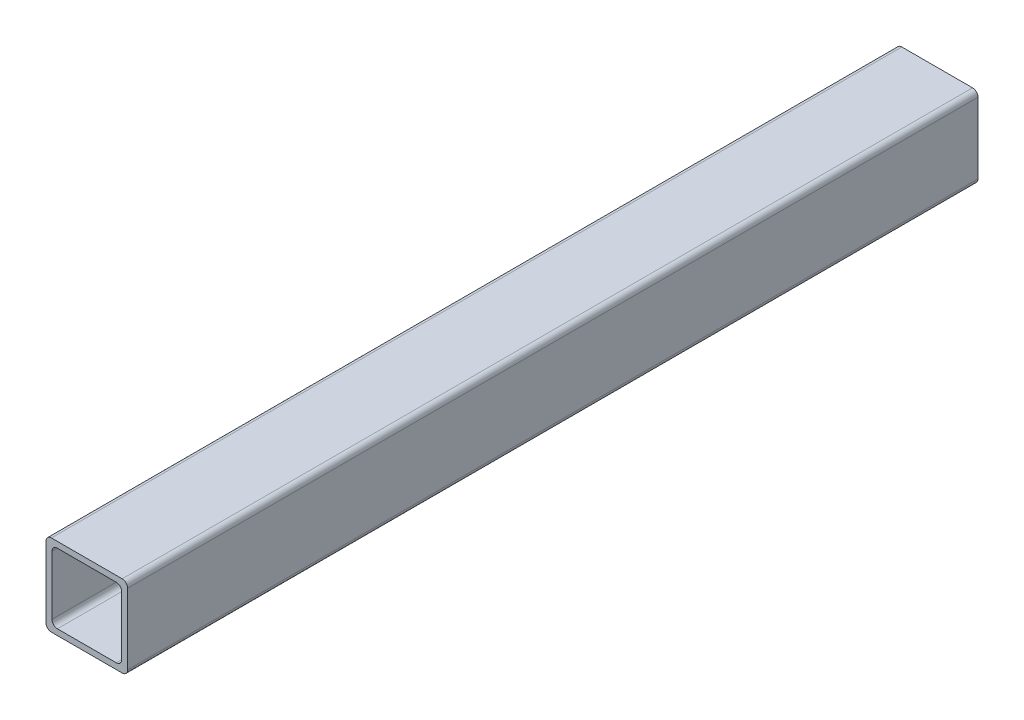
ISO-10303-21;
HEADER;
FILE_DESCRIPTION(('STEP AP214'),'2;1');
FILE_NAME('part.step','',(''),(''),'','','');
FILE_SCHEMA(('AUTOMOTIVE_DESIGN { 1 0 10303 214 1 1 1 1 }'));
ENDSEC;
DATA;
#1=APPLICATION_CONTEXT('core data for automotive mechanical design processes');
#2=APPLICATION_PROTOCOL_DEFINITION('international standard','automotive_design',2000,#1);
#3=PRODUCT_CONTEXT('',#1,'mechanical');
#4=PRODUCT('Part','Part','',(#3));
#5=PRODUCT_RELATED_PRODUCT_CATEGORY('part','',(#4));
#6=PRODUCT_DEFINITION_FORMATION('','',#4);
#7=PRODUCT_DEFINITION_CONTEXT('part definition',#1,'design');
#8=PRODUCT_DEFINITION('design','',#6,#7);
#9=PRODUCT_DEFINITION_SHAPE('','',#8);
#10=(LENGTH_UNIT() NAMED_UNIT(*) SI_UNIT(.MILLI.,.METRE.));
#11=(NAMED_UNIT(*) PLANE_ANGLE_UNIT() SI_UNIT($,.RADIAN.));
#12=(NAMED_UNIT(*) SI_UNIT($,.STERADIAN.) SOLID_ANGLE_UNIT());
#13=UNCERTAINTY_MEASURE_WITH_UNIT(LENGTH_MEASURE(1.E-05),#10,'distance_accuracy_value','');
#14=(GEOMETRIC_REPRESENTATION_CONTEXT(3) GLOBAL_UNCERTAINTY_ASSIGNED_CONTEXT((#13)) GLOBAL_UNIT_ASSIGNED_CONTEXT((#10,
#11,#12)) REPRESENTATION_CONTEXT('',''));
#15=CARTESIAN_POINT('',(0.,0.,0.));
#16=DIRECTION('',(0.,0.,1.));
#17=DIRECTION('',(1.,0.,0.));
#18=AXIS2_PLACEMENT_3D('',#15,#16,#17);
#19=CARTESIAN_POINT('',(2.54,-35.56,397.));
#20=DIRECTION('',(0.,0.,1.));
#21=DIRECTION('',(1.,0.,0.));
#22=AXIS2_PLACEMENT_3D('',#19,#20,#21);
#23=PLANE('',#22);
#24=CARTESIAN_POINT('',(2.54,-35.56,397.));
#25=DIRECTION('',(0.,0.,1.));
#26=DIRECTION('',(1.,0.,0.));
#27=AXIS2_PLACEMENT_3D('',#24,#25,#26);
#28=CIRCLE('',#27,2.54);
#29=CARTESIAN_POINT('',(0.,-35.56,397.));
#30=VERTEX_POINT('',#29);
#31=CARTESIAN_POINT('',(2.54000000000002,-38.1,397.));
#32=VERTEX_POINT('',#31);
#33=EDGE_CURVE('E211',#30,#32,#28,.T.);
#34=ORIENTED_EDGE('',*,*,#33,.T.);
#35=DIRECTION('',(1.,0.,0.));
#36=VECTOR('',#35,1.);
#37=CARTESIAN_POINT('',(2.54000000000002,-38.1,397.));
#38=LINE('',#37,#36);
#39=CARTESIAN_POINT('',(35.56,-38.1,397.));
#40=VERTEX_POINT('',#39);
#41=EDGE_CURVE('E214',#32,#40,#38,.T.);
#42=ORIENTED_EDGE('',*,*,#41,.T.);
#43=CARTESIAN_POINT('',(35.56,-35.56,397.));
#44=DIRECTION('',(0.,0.,1.));
#45=DIRECTION('',(-1.,0.,0.));
#46=AXIS2_PLACEMENT_3D('',#43,#44,#45);
#47=CIRCLE('',#46,2.54);
#48=CARTESIAN_POINT('',(38.1,-35.56,397.));
#49=VERTEX_POINT('',#48);
#50=EDGE_CURVE('E217',#40,#49,#47,.T.);
#51=ORIENTED_EDGE('',*,*,#50,.T.);
#52=DIRECTION('',(0.,1.,0.));
#53=VECTOR('',#52,1.);
#54=CARTESIAN_POINT('',(38.1,-2.54000000000002,397.));
#55=LINE('',#54,#53);
#56=CARTESIAN_POINT('',(38.1,-2.54000000000002,397.));
#57=VERTEX_POINT('',#56);
#58=EDGE_CURVE('E219',#49,#57,#55,.T.);
#59=ORIENTED_EDGE('',*,*,#58,.T.);
#60=CARTESIAN_POINT('',(35.56,-2.54,397.));
#61=DIRECTION('',(0.,0.,1.));
#62=DIRECTION('',(1.,0.,0.));
#63=AXIS2_PLACEMENT_3D('',#60,#61,#62);
#64=CIRCLE('',#63,2.54);
#65=CARTESIAN_POINT('',(35.56,0.,397.));
#66=VERTEX_POINT('',#65);
#67=EDGE_CURVE('E221',#57,#66,#64,.T.);
#68=ORIENTED_EDGE('',*,*,#67,.T.);
#69=DIRECTION('',(-1.,0.,0.));
#70=VECTOR('',#69,1.);
#71=CARTESIAN_POINT('',(2.54000000000002,0.,397.));
#72=LINE('',#71,#70);
#73=CARTESIAN_POINT('',(2.54000000000002,0.,397.));
#74=VERTEX_POINT('',#73);
#75=EDGE_CURVE('E223',#66,#74,#72,.T.);
#76=ORIENTED_EDGE('',*,*,#75,.T.);
#77=CARTESIAN_POINT('',(2.54,-2.54,397.));
#78=DIRECTION('',(0.,0.,1.));
#79=DIRECTION('',(-1.,0.,0.));
#80=AXIS2_PLACEMENT_3D('',#77,#78,#79);
#81=CIRCLE('',#80,2.54);
#82=CARTESIAN_POINT('',(0.,-2.54000000000002,397.));
#83=VERTEX_POINT('',#82);
#84=EDGE_CURVE('E225',#74,#83,#81,.T.);
#85=ORIENTED_EDGE('',*,*,#84,.T.);
#86=DIRECTION('',(0.,-1.,0.));
#87=VECTOR('',#86,1.);
#88=CARTESIAN_POINT('',(0.,-2.54000000000002,397.));
#89=LINE('',#88,#87);
#90=EDGE_CURVE('E227',#83,#30,#89,.T.);
#91=ORIENTED_EDGE('',*,*,#90,.T.);
#92=EDGE_LOOP('',(#34,#42,#51,#59,#68,#76,#85,#91));
#93=FACE_BOUND('',#92,.T.);
#94=DIRECTION('',(1.,0.,0.));
#95=VECTOR('',#94,1.);
#96=CARTESIAN_POINT('',(5.30860000000002,-35.3314,397.));
#97=LINE('',#96,#95);
#98=CARTESIAN_POINT('',(5.30860000000002,-35.3314,397.));
#99=VERTEX_POINT('',#98);
#100=CARTESIAN_POINT('',(32.7914,-35.3314,397.));
#101=VERTEX_POINT('',#100);
#102=EDGE_CURVE('E154',#99,#101,#97,.T.);
#103=ORIENTED_EDGE('',*,*,#102,.F.);
#104=CARTESIAN_POINT('',(5.3086,-32.7914,397.));
#105=DIRECTION('',(0.,0.,1.));
#106=DIRECTION('',(1.,0.,0.));
#107=AXIS2_PLACEMENT_3D('',#104,#105,#106);
#108=CIRCLE('',#107,2.54);
#109=CARTESIAN_POINT('',(2.7686,-32.7914,397.));
#110=VERTEX_POINT('',#109);
#111=EDGE_CURVE('E146',#110,#99,#108,.T.);
#112=ORIENTED_EDGE('',*,*,#111,.F.);
#113=DIRECTION('',(0.,-1.,0.));
#114=VECTOR('',#113,1.);
#115=CARTESIAN_POINT('',(2.7686,-5.30860000000002,397.));
#116=LINE('',#115,#114);
#117=CARTESIAN_POINT('',(2.7686,-5.30860000000002,397.));
#118=VERTEX_POINT('',#117);
#119=EDGE_CURVE('E179',#118,#110,#116,.T.);
#120=ORIENTED_EDGE('',*,*,#119,.F.);
#121=CARTESIAN_POINT('',(5.3086,-5.3086,397.));
#122=DIRECTION('',(0.,0.,1.));
#123=DIRECTION('',(1.,0.,0.));
#124=AXIS2_PLACEMENT_3D('',#121,#122,#123);
#125=CIRCLE('',#124,2.54);
#126=CARTESIAN_POINT('',(5.30860000000002,-2.7686,397.));
#127=VERTEX_POINT('',#126);
#128=EDGE_CURVE('E177',#127,#118,#125,.T.);
#129=ORIENTED_EDGE('',*,*,#128,.F.);
#130=DIRECTION('',(-1.,0.,0.));
#131=VECTOR('',#130,1.);
#132=CARTESIAN_POINT('',(5.30860000000002,-2.7686,397.));
#133=LINE('',#132,#131);
#134=CARTESIAN_POINT('',(32.7914,-2.7686,397.));
#135=VERTEX_POINT('',#134);
#136=EDGE_CURVE('E175',#135,#127,#133,.T.);
#137=ORIENTED_EDGE('',*,*,#136,.F.);
#138=CARTESIAN_POINT('',(32.7914,-5.3086,397.));
#139=DIRECTION('',(0.,0.,1.));
#140=DIRECTION('',(1.,0.,0.));
#141=AXIS2_PLACEMENT_3D('',#138,#139,#140);
#142=CIRCLE('',#141,2.54);
#143=CARTESIAN_POINT('',(35.3314,-5.30860000000002,397.));
#144=VERTEX_POINT('',#143);
#145=EDGE_CURVE('E173',#144,#135,#142,.T.);
#146=ORIENTED_EDGE('',*,*,#145,.F.);
#147=DIRECTION('',(0.,1.,0.));
#148=VECTOR('',#147,1.);
#149=CARTESIAN_POINT('',(35.3314,-5.30860000000002,397.));
#150=LINE('',#149,#148);
#151=CARTESIAN_POINT('',(35.3314,-32.7914,397.));
#152=VERTEX_POINT('',#151);
#153=EDGE_CURVE('E169',#152,#144,#150,.T.);
#154=ORIENTED_EDGE('',*,*,#153,.F.);
#155=CARTESIAN_POINT('',(32.7914,-32.7914,397.));
#156=DIRECTION('',(0.,0.,1.));
#157=DIRECTION('',(1.,0.,0.));
#158=AXIS2_PLACEMENT_3D('',#155,#156,#157);
#159=CIRCLE('',#158,2.54);
#160=EDGE_CURVE('E167',#101,#152,#159,.T.);
#161=ORIENTED_EDGE('',*,*,#160,.F.);
#162=EDGE_LOOP('',(#103,#112,#120,#129,#137,#146,#154,#161));
#163=FACE_BOUND('',#162,.T.);
#164=ADVANCED_FACE('F33',(#93,#163),#23,.T.);
#165=CARTESIAN_POINT('',(2.54,-35.56,0.));
#166=DIRECTION('',(0.,0.,1.));
#167=DIRECTION('',(1.,0.,0.));
#168=AXIS2_PLACEMENT_3D('',#165,#166,#167);
#169=PLANE('',#168);
#170=CARTESIAN_POINT('',(2.54,-35.56,0.));
#171=DIRECTION('',(0.,0.,1.));
#172=DIRECTION('',(1.,0.,0.));
#173=AXIS2_PLACEMENT_3D('',#170,#171,#172);
#174=CIRCLE('',#173,2.54);
#175=CARTESIAN_POINT('',(0.,-35.56,0.));
#176=VERTEX_POINT('',#175);
#177=CARTESIAN_POINT('',(2.54000000000002,-38.1,0.));
#178=VERTEX_POINT('',#177);
#179=EDGE_CURVE('E162',#176,#178,#174,.T.);
#180=ORIENTED_EDGE('',*,*,#179,.F.);
#181=DIRECTION('',(0.,-1.,0.));
#182=VECTOR('',#181,1.);
#183=CARTESIAN_POINT('',(0.,-2.54000000000002,0.));
#184=LINE('',#183,#182);
#185=CARTESIAN_POINT('',(0.,-2.54000000000002,0.));
#186=VERTEX_POINT('',#185);
#187=EDGE_CURVE('E215',#186,#176,#184,.T.);
#188=ORIENTED_EDGE('',*,*,#187,.F.);
#189=CARTESIAN_POINT('',(2.54,-2.54,0.));
#190=DIRECTION('',(0.,0.,1.));
#191=DIRECTION('',(-1.,0.,0.));
#192=AXIS2_PLACEMENT_3D('',#189,#190,#191);
#193=CIRCLE('',#192,2.54);
#194=CARTESIAN_POINT('',(2.54000000000002,0.,0.));
#195=VERTEX_POINT('',#194);
#196=EDGE_CURVE('E242',#195,#186,#193,.T.);
#197=ORIENTED_EDGE('',*,*,#196,.F.);
#198=DIRECTION('',(-1.,0.,0.));
#199=VECTOR('',#198,1.);
#200=CARTESIAN_POINT('',(2.54000000000002,0.,0.));
#201=LINE('',#200,#199);
#202=CARTESIAN_POINT('',(35.56,0.,0.));
#203=VERTEX_POINT('',#202);
#204=EDGE_CURVE('E240',#203,#195,#201,.T.);
#205=ORIENTED_EDGE('',*,*,#204,.F.);
#206=CARTESIAN_POINT('',(35.56,-2.54,0.));
#207=DIRECTION('',(0.,0.,1.));
#208=DIRECTION('',(1.,0.,0.));
#209=AXIS2_PLACEMENT_3D('',#206,#207,#208);
#210=CIRCLE('',#209,2.54);
#211=CARTESIAN_POINT('',(38.1,-2.54000000000002,0.));
#212=VERTEX_POINT('',#211);
#213=EDGE_CURVE('E238',#212,#203,#210,.T.);
#214=ORIENTED_EDGE('',*,*,#213,.F.);
#215=DIRECTION('',(0.,1.,0.));
#216=VECTOR('',#215,1.);
#217=CARTESIAN_POINT('',(38.1,-2.54000000000002,0.));
#218=LINE('',#217,#216);
#219=CARTESIAN_POINT('',(38.1,-35.56,0.));
#220=VERTEX_POINT('',#219);
#221=EDGE_CURVE('E236',#220,#212,#218,.T.);
#222=ORIENTED_EDGE('',*,*,#221,.F.);
#223=CARTESIAN_POINT('',(35.56,-35.56,0.));
#224=DIRECTION('',(0.,0.,1.));
#225=DIRECTION('',(-1.,0.,0.));
#226=AXIS2_PLACEMENT_3D('',#223,#224,#225);
#227=CIRCLE('',#226,2.54);
#228=CARTESIAN_POINT('',(35.56,-38.1,0.));
#229=VERTEX_POINT('',#228);
#230=EDGE_CURVE('E234',#229,#220,#227,.T.);
#231=ORIENTED_EDGE('',*,*,#230,.F.);
#232=DIRECTION('',(1.,0.,0.));
#233=VECTOR('',#232,1.);
#234=CARTESIAN_POINT('',(2.54000000000002,-38.1,0.));
#235=LINE('',#234,#233);
#236=EDGE_CURVE('E232',#178,#229,#235,.T.);
#237=ORIENTED_EDGE('',*,*,#236,.F.);
#238=EDGE_LOOP('',(#180,#188,#197,#205,#214,#222,#231,#237));
#239=FACE_BOUND('',#238,.T.);
#240=CARTESIAN_POINT('',(5.3086,-32.7914,0.));
#241=DIRECTION('',(0.,0.,1.));
#242=DIRECTION('',(1.,0.,0.));
#243=AXIS2_PLACEMENT_3D('',#240,#241,#242);
#244=CIRCLE('',#243,2.54);
#245=CARTESIAN_POINT('',(2.7686,-32.7914,0.));
#246=VERTEX_POINT('',#245);
#247=CARTESIAN_POINT('',(5.30860000000002,-35.3314,0.));
#248=VERTEX_POINT('',#247);
#249=EDGE_CURVE('E56',#246,#248,#244,.T.);
#250=ORIENTED_EDGE('',*,*,#249,.T.);
#251=DIRECTION('',(1.,0.,0.));
#252=VECTOR('',#251,1.);
#253=CARTESIAN_POINT('',(5.30860000000002,-35.3314,0.));
#254=LINE('',#253,#252);
#255=CARTESIAN_POINT('',(32.7914,-35.3314,0.));
#256=VERTEX_POINT('',#255);
#257=EDGE_CURVE('E161',#248,#256,#254,.T.);
#258=ORIENTED_EDGE('',*,*,#257,.T.);
#259=CARTESIAN_POINT('',(32.7914,-32.7914,0.));
#260=DIRECTION('',(0.,0.,1.));
#261=DIRECTION('',(1.,0.,0.));
#262=AXIS2_PLACEMENT_3D('',#259,#260,#261);
#263=CIRCLE('',#262,2.54);
#264=CARTESIAN_POINT('',(35.3314,-32.7914,0.));
#265=VERTEX_POINT('',#264);
#266=EDGE_CURVE('E183',#256,#265,#263,.T.);
#267=ORIENTED_EDGE('',*,*,#266,.T.);
#268=DIRECTION('',(0.,1.,0.));
#269=VECTOR('',#268,1.);
#270=CARTESIAN_POINT('',(35.3314,-5.30860000000002,0.));
#271=LINE('',#270,#269);
#272=CARTESIAN_POINT('',(35.3314,-5.30860000000002,0.));
#273=VERTEX_POINT('',#272);
#274=EDGE_CURVE('E186',#265,#273,#271,.T.);
#275=ORIENTED_EDGE('',*,*,#274,.T.);
#276=CARTESIAN_POINT('',(32.7914,-5.3086,0.));
#277=DIRECTION('',(0.,0.,1.));
#278=DIRECTION('',(1.,0.,0.));
#279=AXIS2_PLACEMENT_3D('',#276,#277,#278);
#280=CIRCLE('',#279,2.54);
#281=CARTESIAN_POINT('',(32.7914,-2.7686,0.));
#282=VERTEX_POINT('',#281);
#283=EDGE_CURVE('E189',#273,#282,#280,.T.);
#284=ORIENTED_EDGE('',*,*,#283,.T.);
#285=DIRECTION('',(-1.,0.,0.));
#286=VECTOR('',#285,1.);
#287=CARTESIAN_POINT('',(5.30860000000002,-2.7686,0.));
#288=LINE('',#287,#286);
#289=CARTESIAN_POINT('',(5.30860000000002,-2.7686,0.));
#290=VERTEX_POINT('',#289);
#291=EDGE_CURVE('E192',#282,#290,#288,.T.);
#292=ORIENTED_EDGE('',*,*,#291,.T.);
#293=CARTESIAN_POINT('',(5.3086,-5.3086,0.));
#294=DIRECTION('',(0.,0.,1.));
#295=DIRECTION('',(1.,0.,0.));
#296=AXIS2_PLACEMENT_3D('',#293,#294,#295);
#297=CIRCLE('',#296,2.54);
#298=CARTESIAN_POINT('',(2.7686,-5.30860000000002,0.));
#299=VERTEX_POINT('',#298);
#300=EDGE_CURVE('E195',#290,#299,#297,.T.);
#301=ORIENTED_EDGE('',*,*,#300,.T.);
#302=DIRECTION('',(0.,-1.,0.));
#303=VECTOR('',#302,1.);
#304=CARTESIAN_POINT('',(2.7686,-5.30860000000002,0.));
#305=LINE('',#304,#303);
#306=EDGE_CURVE('E155',#299,#246,#305,.T.);
#307=ORIENTED_EDGE('',*,*,#306,.T.);
#308=EDGE_LOOP('',(#250,#258,#267,#275,#284,#292,#301,#307));
#309=FACE_BOUND('',#308,.T.);
#310=ADVANCED_FACE('F272',(#239,#309),#169,.F.);
#311=CARTESIAN_POINT('',(2.54,-35.56,397.));
#312=DIRECTION('',(0.,0.,-1.));
#313=DIRECTION('',(-1.,0.,0.));
#314=AXIS2_PLACEMENT_3D('',#311,#312,#313);
#315=CYLINDRICAL_SURFACE('',#314,2.54);
#316=ORIENTED_EDGE('',*,*,#179,.T.);
#317=DIRECTION('',(0.,0.,-1.));
#318=VECTOR('',#317,1.);
#319=CARTESIAN_POINT('',(2.54000000000002,-38.1,397.));
#320=LINE('',#319,#318);
#321=EDGE_CURVE('E11',#32,#178,#320,.T.);
#322=ORIENTED_EDGE('',*,*,#321,.F.);
#323=ORIENTED_EDGE('',*,*,#33,.F.);
#324=DIRECTION('',(0.,0.,-1.));
#325=VECTOR('',#324,1.);
#326=CARTESIAN_POINT('',(0.,-35.56,397.));
#327=LINE('',#326,#325);
#328=EDGE_CURVE('E229',#30,#176,#327,.T.);
#329=ORIENTED_EDGE('',*,*,#328,.T.);
#330=EDGE_LOOP('',(#316,#322,#323,#329));
#331=FACE_BOUND('',#330,.T.);
#332=ADVANCED_FACE('F35',(#331),#315,.T.);
#333=CARTESIAN_POINT('',(2.54000000000002,-38.1,397.));
#334=DIRECTION('',(0.,1.,0.));
#335=DIRECTION('',(0.,0.,1.));
#336=AXIS2_PLACEMENT_3D('',#333,#334,#335);
#337=PLANE('',#336);
#338=ORIENTED_EDGE('',*,*,#236,.T.);
#339=DIRECTION('',(0.,0.,-1.));
#340=VECTOR('',#339,1.);
#341=CARTESIAN_POINT('',(35.56,-38.1,397.));
#342=LINE('',#341,#340);
#343=EDGE_CURVE('E41',#40,#229,#342,.T.);
#344=ORIENTED_EDGE('',*,*,#343,.F.);
#345=ORIENTED_EDGE('',*,*,#41,.F.);
#346=ORIENTED_EDGE('',*,*,#321,.T.);
#347=EDGE_LOOP('',(#338,#344,#345,#346));
#348=FACE_BOUND('',#347,.T.);
#349=ADVANCED_FACE('F289',(#348),#337,.F.);
#350=CARTESIAN_POINT('',(35.56,-35.56,397.));
#351=DIRECTION('',(0.,0.,-1.));
#352=DIRECTION('',(-1.,0.,0.));
#353=AXIS2_PLACEMENT_3D('',#350,#351,#352);
#354=CYLINDRICAL_SURFACE('',#353,2.54);
#355=ORIENTED_EDGE('',*,*,#230,.T.);
#356=DIRECTION('',(0.,0.,-1.));
#357=VECTOR('',#356,1.);
#358=CARTESIAN_POINT('',(38.1,-35.56,397.));
#359=LINE('',#358,#357);
#360=EDGE_CURVE('E259',#49,#220,#359,.T.);
#361=ORIENTED_EDGE('',*,*,#360,.F.);
#362=ORIENTED_EDGE('',*,*,#50,.F.);
#363=ORIENTED_EDGE('',*,*,#343,.T.);
#364=EDGE_LOOP('',(#355,#361,#362,#363));
#365=FACE_BOUND('',#364,.T.);
#366=ADVANCED_FACE('F266',(#365),#354,.T.);
#367=CARTESIAN_POINT('',(38.1,-2.54000000000002,397.));
#368=DIRECTION('',(-1.,0.,0.));
#369=DIRECTION('',(0.,-1.,0.));
#370=AXIS2_PLACEMENT_3D('',#367,#368,#369);
#371=PLANE('',#370);
#372=ORIENTED_EDGE('',*,*,#221,.T.);
#373=DIRECTION('',(0.,0.,-1.));
#374=VECTOR('',#373,1.);
#375=CARTESIAN_POINT('',(38.1,-2.54000000000002,397.));
#376=LINE('',#375,#374);
#377=EDGE_CURVE('E256',#57,#212,#376,.T.);
#378=ORIENTED_EDGE('',*,*,#377,.F.);
#379=ORIENTED_EDGE('',*,*,#58,.F.);
#380=ORIENTED_EDGE('',*,*,#360,.T.);
#381=EDGE_LOOP('',(#372,#378,#379,#380));
#382=FACE_BOUND('',#381,.T.);
#383=ADVANCED_FACE('F278',(#382),#371,.F.);
#384=CARTESIAN_POINT('',(35.56,-2.54,397.));
#385=DIRECTION('',(0.,0.,-1.));
#386=DIRECTION('',(-1.,0.,0.));
#387=AXIS2_PLACEMENT_3D('',#384,#385,#386);
#388=CYLINDRICAL_SURFACE('',#387,2.54);
#389=ORIENTED_EDGE('',*,*,#213,.T.);
#390=DIRECTION('',(0.,0.,-1.));
#391=VECTOR('',#390,1.);
#392=CARTESIAN_POINT('',(35.56,0.,397.));
#393=LINE('',#392,#391);
#394=EDGE_CURVE('E253',#66,#203,#393,.T.);
#395=ORIENTED_EDGE('',*,*,#394,.F.);
#396=ORIENTED_EDGE('',*,*,#67,.F.);
#397=ORIENTED_EDGE('',*,*,#377,.T.);
#398=EDGE_LOOP('',(#389,#395,#396,#397));
#399=FACE_BOUND('',#398,.T.);
#400=ADVANCED_FACE('F282',(#399),#388,.T.);
#401=CARTESIAN_POINT('',(2.54000000000002,0.,397.));
#402=DIRECTION('',(0.,-1.,0.));
#403=DIRECTION('',(0.,0.,-1.));
#404=AXIS2_PLACEMENT_3D('',#401,#402,#403);
#405=PLANE('',#404);
#406=ORIENTED_EDGE('',*,*,#204,.T.);
#407=DIRECTION('',(0.,0.,-1.));
#408=VECTOR('',#407,1.);
#409=CARTESIAN_POINT('',(2.54000000000002,0.,397.));
#410=LINE('',#409,#408);
#411=EDGE_CURVE('E250',#74,#195,#410,.T.);
#412=ORIENTED_EDGE('',*,*,#411,.F.);
#413=ORIENTED_EDGE('',*,*,#75,.F.);
#414=ORIENTED_EDGE('',*,*,#394,.T.);
#415=EDGE_LOOP('',(#406,#412,#413,#414));
#416=FACE_BOUND('',#415,.T.);
#417=ADVANCED_FACE('F302',(#416),#405,.F.);
#418=CARTESIAN_POINT('',(2.54,-2.54,397.));
#419=DIRECTION('',(0.,0.,-1.));
#420=DIRECTION('',(-1.,0.,0.));
#421=AXIS2_PLACEMENT_3D('',#418,#419,#420);
#422=CYLINDRICAL_SURFACE('',#421,2.54);
#423=ORIENTED_EDGE('',*,*,#196,.T.);
#424=DIRECTION('',(0.,0.,-1.));
#425=VECTOR('',#424,1.);
#426=CARTESIAN_POINT('',(0.,-2.54000000000002,397.));
#427=LINE('',#426,#425);
#428=EDGE_CURVE('E247',#83,#186,#427,.T.);
#429=ORIENTED_EDGE('',*,*,#428,.F.);
#430=ORIENTED_EDGE('',*,*,#84,.F.);
#431=ORIENTED_EDGE('',*,*,#411,.T.);
#432=EDGE_LOOP('',(#423,#429,#430,#431));
#433=FACE_BOUND('',#432,.T.);
#434=ADVANCED_FACE('F300',(#433),#422,.T.);
#435=CARTESIAN_POINT('',(0.,-2.54000000000002,397.));
#436=DIRECTION('',(1.,0.,0.));
#437=DIRECTION('',(0.,1.,0.));
#438=AXIS2_PLACEMENT_3D('',#435,#436,#437);
#439=PLANE('',#438);
#440=ORIENTED_EDGE('',*,*,#187,.T.);
#441=ORIENTED_EDGE('',*,*,#328,.F.);
#442=ORIENTED_EDGE('',*,*,#90,.F.);
#443=ORIENTED_EDGE('',*,*,#428,.T.);
#444=EDGE_LOOP('',(#440,#441,#442,#443));
#445=FACE_BOUND('',#444,.T.);
#446=ADVANCED_FACE('F295',(#445),#439,.F.);
#447=CARTESIAN_POINT('',(5.3086,-32.7914,397.));
#448=DIRECTION('',(0.,0.,-1.));
#449=DIRECTION('',(-1.,0.,0.));
#450=AXIS2_PLACEMENT_3D('',#447,#448,#449);
#451=CYLINDRICAL_SURFACE('',#450,2.54);
#452=ORIENTED_EDGE('',*,*,#249,.F.);
#453=DIRECTION('',(0.,0.,-1.));
#454=VECTOR('',#453,1.);
#455=CARTESIAN_POINT('',(2.7686,-32.7914,397.));
#456=LINE('',#455,#454);
#457=EDGE_CURVE('E150',#110,#246,#456,.T.);
#458=ORIENTED_EDGE('',*,*,#457,.F.);
#459=ORIENTED_EDGE('',*,*,#111,.T.);
#460=DIRECTION('',(0.,0.,-1.));
#461=VECTOR('',#460,1.);
#462=CARTESIAN_POINT('',(5.30860000000002,-35.3314,397.));
#463=LINE('',#462,#461);
#464=EDGE_CURVE('E149',#99,#248,#463,.T.);
#465=ORIENTED_EDGE('',*,*,#464,.T.);
#466=EDGE_LOOP('',(#452,#458,#459,#465));
#467=FACE_BOUND('',#466,.T.);
#468=ADVANCED_FACE('F148',(#467),#451,.F.);
#469=CARTESIAN_POINT('',(5.30860000000002,-35.3314,397.));
#470=DIRECTION('',(0.,1.,0.));
#471=DIRECTION('',(0.,0.,1.));
#472=AXIS2_PLACEMENT_3D('',#469,#470,#471);
#473=PLANE('',#472);
#474=ORIENTED_EDGE('',*,*,#257,.F.);
#475=ORIENTED_EDGE('',*,*,#464,.F.);
#476=ORIENTED_EDGE('',*,*,#102,.T.);
#477=DIRECTION('',(0.,0.,-1.));
#478=VECTOR('',#477,1.);
#479=CARTESIAN_POINT('',(32.7914,-35.3314,397.));
#480=LINE('',#479,#478);
#481=EDGE_CURVE('E163',#101,#256,#480,.T.);
#482=ORIENTED_EDGE('',*,*,#481,.T.);
#483=EDGE_LOOP('',(#474,#475,#476,#482));
#484=FACE_BOUND('',#483,.T.);
#485=ADVANCED_FACE('F158',(#484),#473,.T.);
#486=CARTESIAN_POINT('',(32.7914,-32.7914,397.));
#487=DIRECTION('',(0.,0.,-1.));
#488=DIRECTION('',(-1.,0.,0.));
#489=AXIS2_PLACEMENT_3D('',#486,#487,#488);
#490=CYLINDRICAL_SURFACE('',#489,2.54);
#491=ORIENTED_EDGE('',*,*,#266,.F.);
#492=ORIENTED_EDGE('',*,*,#481,.F.);
#493=ORIENTED_EDGE('',*,*,#160,.T.);
#494=DIRECTION('',(0.,0.,-1.));
#495=VECTOR('',#494,1.);
#496=CARTESIAN_POINT('',(35.3314,-32.7914,397.));
#497=LINE('',#496,#495);
#498=EDGE_CURVE('E208',#152,#265,#497,.T.);
#499=ORIENTED_EDGE('',*,*,#498,.T.);
#500=EDGE_LOOP('',(#491,#492,#493,#499));
#501=FACE_BOUND('',#500,.T.);
#502=ADVANCED_FACE('F327',(#501),#490,.F.);
#503=CARTESIAN_POINT('',(35.3314,-5.30860000000002,397.));
#504=DIRECTION('',(-1.,0.,0.));
#505=DIRECTION('',(0.,0.,1.));
#506=AXIS2_PLACEMENT_3D('',#503,#504,#505);
#507=PLANE('',#506);
#508=ORIENTED_EDGE('',*,*,#274,.F.);
#509=ORIENTED_EDGE('',*,*,#498,.F.);
#510=ORIENTED_EDGE('',*,*,#153,.T.);
#511=DIRECTION('',(0.,0.,-1.));
#512=VECTOR('',#511,1.);
#513=CARTESIAN_POINT('',(35.3314,-5.30860000000002,397.));
#514=LINE('',#513,#512);
#515=EDGE_CURVE('E206',#144,#273,#514,.T.);
#516=ORIENTED_EDGE('',*,*,#515,.T.);
#517=EDGE_LOOP('',(#508,#509,#510,#516));
#518=FACE_BOUND('',#517,.T.);
#519=ADVANCED_FACE('F331',(#518),#507,.T.);
#520=CARTESIAN_POINT('',(32.7914,-5.3086,397.));
#521=DIRECTION('',(0.,0.,-1.));
#522=DIRECTION('',(-1.,0.,0.));
#523=AXIS2_PLACEMENT_3D('',#520,#521,#522);
#524=CYLINDRICAL_SURFACE('',#523,2.54);
#525=ORIENTED_EDGE('',*,*,#283,.F.);
#526=ORIENTED_EDGE('',*,*,#515,.F.);
#527=ORIENTED_EDGE('',*,*,#145,.T.);
#528=DIRECTION('',(0.,0.,-1.));
#529=VECTOR('',#528,1.);
#530=CARTESIAN_POINT('',(32.7914,-2.7686,397.));
#531=LINE('',#530,#529);
#532=EDGE_CURVE('E204',#135,#282,#531,.T.);
#533=ORIENTED_EDGE('',*,*,#532,.T.);
#534=EDGE_LOOP('',(#525,#526,#527,#533));
#535=FACE_BOUND('',#534,.T.);
#536=ADVANCED_FACE('F337',(#535),#524,.F.);
#537=CARTESIAN_POINT('',(5.30860000000002,-2.7686,397.));
#538=DIRECTION('',(0.,-1.,0.));
#539=DIRECTION('',(0.,0.,-1.));
#540=AXIS2_PLACEMENT_3D('',#537,#538,#539);
#541=PLANE('',#540);
#542=ORIENTED_EDGE('',*,*,#291,.F.);
#543=ORIENTED_EDGE('',*,*,#532,.F.);
#544=ORIENTED_EDGE('',*,*,#136,.T.);
#545=DIRECTION('',(0.,0.,-1.));
#546=VECTOR('',#545,1.);
#547=CARTESIAN_POINT('',(5.30860000000002,-2.7686,397.));
#548=LINE('',#547,#546);
#549=EDGE_CURVE('E202',#127,#290,#548,.T.);
#550=ORIENTED_EDGE('',*,*,#549,.T.);
#551=EDGE_LOOP('',(#542,#543,#544,#550));
#552=FACE_BOUND('',#551,.T.);
#553=ADVANCED_FACE('F341',(#552),#541,.T.);
#554=CARTESIAN_POINT('',(5.3086,-5.3086,397.));
#555=DIRECTION('',(0.,0.,-1.));
#556=DIRECTION('',(-1.,0.,0.));
#557=AXIS2_PLACEMENT_3D('',#554,#555,#556);
#558=CYLINDRICAL_SURFACE('',#557,2.54);
#559=ORIENTED_EDGE('',*,*,#300,.F.);
#560=ORIENTED_EDGE('',*,*,#549,.F.);
#561=ORIENTED_EDGE('',*,*,#128,.T.);
#562=DIRECTION('',(0.,0.,-1.));
#563=VECTOR('',#562,1.);
#564=CARTESIAN_POINT('',(2.7686,-5.30860000000002,397.));
#565=LINE('',#564,#563);
#566=EDGE_CURVE('E48',#118,#299,#565,.T.);
#567=ORIENTED_EDGE('',*,*,#566,.T.);
#568=EDGE_LOOP('',(#559,#560,#561,#567));
#569=FACE_BOUND('',#568,.T.);
#570=ADVANCED_FACE('F345',(#569),#558,.F.);
#571=CARTESIAN_POINT('',(2.7686,-5.30860000000002,397.));
#572=DIRECTION('',(1.,0.,0.));
#573=DIRECTION('',(0.,0.,-1.));
#574=AXIS2_PLACEMENT_3D('',#571,#572,#573);
#575=PLANE('',#574);
#576=ORIENTED_EDGE('',*,*,#306,.F.);
#577=ORIENTED_EDGE('',*,*,#566,.F.);
#578=ORIENTED_EDGE('',*,*,#119,.T.);
#579=ORIENTED_EDGE('',*,*,#457,.T.);
#580=EDGE_LOOP('',(#576,#577,#578,#579));
#581=FACE_BOUND('',#580,.T.);
#582=ADVANCED_FACE('F349',(#581),#575,.T.);
#583=CLOSED_SHELL('',(#164,#310,#332,#349,#366,#383,#400,#417,#434,#446,#468,#485,#502,#519,
#536,#553,#570,#582));
#584=MANIFOLD_SOLID_BREP('B2',#583);
#585=ADVANCED_BREP_SHAPE_REPRESENTATION('',(#18,#584),#14);
#586=SHAPE_DEFINITION_REPRESENTATION(#9,#585);
ENDSEC;
END-ISO-10303-21;
